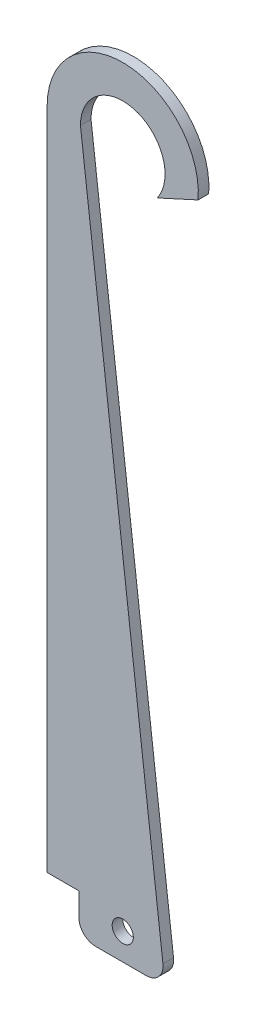
ISO-10303-21;
HEADER;
FILE_DESCRIPTION(('STEP AP214'),'2;1');
FILE_NAME('part.step','',(''),(''),'','','');
FILE_SCHEMA(('AUTOMOTIVE_DESIGN { 1 0 10303 214 1 1 1 1 }'));
ENDSEC;
DATA;
#1=APPLICATION_CONTEXT('core data for automotive mechanical design processes');
#2=APPLICATION_PROTOCOL_DEFINITION('international standard','automotive_design',2000,#1);
#3=PRODUCT_CONTEXT('',#1,'mechanical');
#4=PRODUCT('Part','Part','',(#3));
#5=PRODUCT_RELATED_PRODUCT_CATEGORY('part','',(#4));
#6=PRODUCT_DEFINITION_FORMATION('','',#4);
#7=PRODUCT_DEFINITION_CONTEXT('part definition',#1,'design');
#8=PRODUCT_DEFINITION('design','',#6,#7);
#9=PRODUCT_DEFINITION_SHAPE('','',#8);
#10=(LENGTH_UNIT() NAMED_UNIT(*) SI_UNIT(.MILLI.,.METRE.));
#11=(NAMED_UNIT(*) PLANE_ANGLE_UNIT() SI_UNIT($,.RADIAN.));
#12=(NAMED_UNIT(*) SI_UNIT($,.STERADIAN.) SOLID_ANGLE_UNIT());
#13=UNCERTAINTY_MEASURE_WITH_UNIT(LENGTH_MEASURE(1.E-05),#10,'distance_accuracy_value','');
#14=(GEOMETRIC_REPRESENTATION_CONTEXT(3) GLOBAL_UNCERTAINTY_ASSIGNED_CONTEXT((#13)) GLOBAL_UNIT_ASSIGNED_CONTEXT((#10,
#11,#12)) REPRESENTATION_CONTEXT('',''));
#15=CARTESIAN_POINT('',(0.,0.,0.));
#16=DIRECTION('',(0.,0.,1.));
#17=DIRECTION('',(1.,0.,0.));
#18=AXIS2_PLACEMENT_3D('',#15,#16,#17);
#19=CARTESIAN_POINT('',(-17.3573585994632,404.66044711258,6.35));
#20=DIRECTION('',(0.,0.,-1.));
#21=DIRECTION('',(-1.,0.,0.));
#22=AXIS2_PLACEMENT_3D('',#19,#20,#21);
#23=PLANE('',#22);
#24=DIRECTION('',(1.,0.,0.));
#25=VECTOR('',#24,1.);
#26=CARTESIAN_POINT('',(8.12565323571671,-17.7858203570019,6.35));
#27=LINE('',#26,#25);
#28=CARTESIAN_POINT('',(-33.7152583539214,-17.7858203570019,6.35));
#29=VERTEX_POINT('',#28);
#30=CARTESIAN_POINT('',(-3.15110956813895,-17.7858203570019,6.35));
#31=VERTEX_POINT('',#30);
#32=EDGE_CURVE('E171',#29,#31,#27,.T.);
#33=ORIENTED_EDGE('',*,*,#32,.T.);
#34=CARTESIAN_POINT('',(-3.15110956813895,-7.78582035700187,6.35));
#35=DIRECTION('',(0.,0.,-1.));
#36=DIRECTION('',(-1.,0.,0.));
#37=AXIS2_PLACEMENT_3D('',#34,#35,#36);
#38=CIRCLE('',#37,10.);
#39=CARTESIAN_POINT('',(6.77713111439441,-6.58997883335016,6.35));
#40=VERTEX_POINT('',#39);
#41=EDGE_CURVE('E47',#31,#40,#38,.F.);
#42=ORIENTED_EDGE('',*,*,#41,.T.);
#43=DIRECTION('',(-0.119584152365184,0.992824068253334,0.));
#44=VECTOR('',#43,1.);
#45=CARTESIAN_POINT('',(-42.7573585994632,404.66044711258,6.35));
#46=LINE('',#45,#44);
#47=CARTESIAN_POINT('',(-42.7573585994632,404.66044711258,6.35));
#48=VERTEX_POINT('',#47);
#49=EDGE_CURVE('E134',#40,#48,#46,.T.);
#50=ORIENTED_EDGE('',*,*,#49,.T.);
#51=CARTESIAN_POINT('',(-17.3573585994632,404.66044711258,6.35));
#52=DIRECTION('',(0.,0.,-1.));
#53=DIRECTION('',(-1.,0.,0.));
#54=AXIS2_PLACEMENT_3D('',#51,#52,#53);
#55=CIRCLE('',#54,25.4);
#56=CARTESIAN_POINT('',(3.33112710900608,389.924553549906,6.35));
#57=VERTEX_POINT('',#56);
#58=EDGE_CURVE('E129',#48,#57,#55,.T.);
#59=ORIENTED_EDGE('',*,*,#58,.T.);
#60=DIRECTION('',(0.909444361263456,0.415825629039511,0.));
#61=VECTOR('',#60,1.);
#62=CARTESIAN_POINT('',(3.33112710900608,389.924553549906,6.35));
#63=LINE('',#62,#61);
#64=CARTESIAN_POINT('',(27.9099257899886,401.162728041808,6.35));
#65=VERTEX_POINT('',#64);
#66=EDGE_CURVE('E118',#57,#65,#63,.T.);
#67=ORIENTED_EDGE('',*,*,#66,.T.);
#68=CARTESIAN_POINT('',(-17.3573585994632,404.66044711258,6.35));
#69=DIRECTION('',(0.,0.,1.));
#70=DIRECTION('',(1.,0.,0.));
#71=AXIS2_PLACEMENT_3D('',#68,#69,#70);
#72=CIRCLE('',#71,45.4022144249986);
#73=CARTESIAN_POINT('',(-62.7595730244618,404.66044711258,6.35));
#74=VERTEX_POINT('',#73);
#75=EDGE_CURVE('E128',#65,#74,#72,.T.);
#76=ORIENTED_EDGE('',*,*,#75,.T.);
#77=DIRECTION('',(0.,-1.,0.));
#78=VECTOR('',#77,1.);
#79=CARTESIAN_POINT('',(-62.7595730244618,404.66044711258,6.35));
#80=LINE('',#79,#78);
#81=CARTESIAN_POINT('',(-62.7595730244618,6.09017964299815,6.35));
#82=VERTEX_POINT('',#81);
#83=EDGE_CURVE('E219',#74,#82,#80,.T.);
#84=ORIENTED_EDGE('',*,*,#83,.T.);
#85=DIRECTION('',(1.,0.,0.));
#86=VECTOR('',#85,1.);
#87=CARTESIAN_POINT('',(-43.7152583539215,6.09017964299815,6.35));
#88=LINE('',#87,#86);
#89=CARTESIAN_POINT('',(-43.7152583539215,6.09017964299815,6.35));
#90=VERTEX_POINT('',#89);
#91=EDGE_CURVE('E240',#82,#90,#88,.T.);
#92=ORIENTED_EDGE('',*,*,#91,.T.);
#93=DIRECTION('',(0.,-1.,0.));
#94=VECTOR('',#93,1.);
#95=CARTESIAN_POINT('',(-43.7152583539215,-17.7858203570019,6.35));
#96=LINE('',#95,#94);
#97=CARTESIAN_POINT('',(-43.7152583539215,-7.78582035700185,6.35));
#98=VERTEX_POINT('',#97);
#99=EDGE_CURVE('E237',#90,#98,#96,.T.);
#100=ORIENTED_EDGE('',*,*,#99,.T.);
#101=CARTESIAN_POINT('',(-33.7152583539215,-7.78582035700185,6.35));
#102=DIRECTION('',(0.,0.,-1.));
#103=DIRECTION('',(-1.,0.,0.));
#104=AXIS2_PLACEMENT_3D('',#101,#102,#103);
#105=CIRCLE('',#104,10.);
#106=EDGE_CURVE('E167',#98,#29,#105,.F.);
#107=ORIENTED_EDGE('',*,*,#106,.T.);
#108=EDGE_LOOP('',(#33,#42,#50,#59,#67,#76,#84,#92,#100,#107));
#109=FACE_BOUND('',#108,.T.);
#110=CARTESIAN_POINT('',(-17.3573585994632,-1.73955288741989,6.35));
#111=DIRECTION('',(0.,0.,1.));
#112=DIRECTION('',(1.,0.,0.));
#113=AXIS2_PLACEMENT_3D('',#110,#111,#112);
#114=CIRCLE('',#113,6.35);
#115=CARTESIAN_POINT('',(-11.0073585994632,-1.73955288741989,6.35));
#116=VERTEX_POINT('',#115);
#117=EDGE_CURVE('E233',#116,#116,#114,.T.);
#118=ORIENTED_EDGE('',*,*,#117,.F.);
#119=EDGE_LOOP('',(#118));
#120=FACE_BOUND('',#119,.T.);
#121=ADVANCED_FACE('F38',(#109,#120),#23,.F.);
#122=CARTESIAN_POINT('',(-17.3573585994632,404.66044711258,0.));
#123=DIRECTION('',(0.,0.,-1.));
#124=DIRECTION('',(-1.,0.,0.));
#125=AXIS2_PLACEMENT_3D('',#122,#123,#124);
#126=PLANE('',#125);
#127=DIRECTION('',(-0.119584152365184,0.992824068253334,0.));
#128=VECTOR('',#127,1.);
#129=CARTESIAN_POINT('',(-42.7573585994632,404.66044711258,0.));
#130=LINE('',#129,#128);
#131=CARTESIAN_POINT('',(6.77713111439441,-6.58997883335016,0.));
#132=VERTEX_POINT('',#131);
#133=CARTESIAN_POINT('',(-42.7573585994632,404.66044711258,0.));
#134=VERTEX_POINT('',#133);
#135=EDGE_CURVE('E186',#132,#134,#130,.T.);
#136=ORIENTED_EDGE('',*,*,#135,.F.);
#137=CARTESIAN_POINT('',(-3.15110956813895,-7.78582035700187,0.));
#138=DIRECTION('',(0.,0.,-1.));
#139=DIRECTION('',(-1.,0.,0.));
#140=AXIS2_PLACEMENT_3D('',#137,#138,#139);
#141=CIRCLE('',#140,10.);
#142=CARTESIAN_POINT('',(-3.15110956813895,-17.7858203570019,0.));
#143=VERTEX_POINT('',#142);
#144=EDGE_CURVE('E158',#132,#143,#141,.T.);
#145=ORIENTED_EDGE('',*,*,#144,.T.);
#146=DIRECTION('',(1.,0.,0.));
#147=VECTOR('',#146,1.);
#148=CARTESIAN_POINT('',(8.12565323571671,-17.7858203570019,0.));
#149=LINE('',#148,#147);
#150=CARTESIAN_POINT('',(-33.7152583539214,-17.7858203570019,0.));
#151=VERTEX_POINT('',#150);
#152=EDGE_CURVE('E185',#151,#143,#149,.T.);
#153=ORIENTED_EDGE('',*,*,#152,.F.);
#154=CARTESIAN_POINT('',(-33.7152583539215,-7.78582035700185,0.));
#155=DIRECTION('',(0.,0.,-1.));
#156=DIRECTION('',(-1.,0.,0.));
#157=AXIS2_PLACEMENT_3D('',#154,#155,#156);
#158=CIRCLE('',#157,10.);
#159=CARTESIAN_POINT('',(-43.7152583539215,-7.78582035700185,0.));
#160=VERTEX_POINT('',#159);
#161=EDGE_CURVE('E150',#151,#160,#158,.T.);
#162=ORIENTED_EDGE('',*,*,#161,.T.);
#163=DIRECTION('',(0.,-1.,0.));
#164=VECTOR('',#163,1.);
#165=CARTESIAN_POINT('',(-43.7152583539215,-17.7858203570019,0.));
#166=LINE('',#165,#164);
#167=CARTESIAN_POINT('',(-43.7152583539215,6.09017964299815,0.));
#168=VERTEX_POINT('',#167);
#169=EDGE_CURVE('E190',#168,#160,#166,.T.);
#170=ORIENTED_EDGE('',*,*,#169,.F.);
#171=DIRECTION('',(1.,0.,0.));
#172=VECTOR('',#171,1.);
#173=CARTESIAN_POINT('',(-43.7152583539215,6.09017964299815,0.));
#174=LINE('',#173,#172);
#175=CARTESIAN_POINT('',(-62.7595730244618,6.09017964299815,0.));
#176=VERTEX_POINT('',#175);
#177=EDGE_CURVE('E195',#176,#168,#174,.T.);
#178=ORIENTED_EDGE('',*,*,#177,.F.);
#179=DIRECTION('',(0.,-1.,0.));
#180=VECTOR('',#179,1.);
#181=CARTESIAN_POINT('',(-62.7595730244618,404.66044711258,0.));
#182=LINE('',#181,#180);
#183=CARTESIAN_POINT('',(-62.7595730244618,404.66044711258,0.));
#184=VERTEX_POINT('',#183);
#185=EDGE_CURVE('E218',#184,#176,#182,.T.);
#186=ORIENTED_EDGE('',*,*,#185,.F.);
#187=CARTESIAN_POINT('',(-17.3573585994632,404.66044711258,0.));
#188=DIRECTION('',(0.,0.,1.));
#189=DIRECTION('',(1.,0.,0.));
#190=AXIS2_PLACEMENT_3D('',#187,#188,#189);
#191=CIRCLE('',#190,45.4022144249986);
#192=CARTESIAN_POINT('',(27.9099257899886,401.162728041808,0.));
#193=VERTEX_POINT('',#192);
#194=EDGE_CURVE('E223',#193,#184,#191,.T.);
#195=ORIENTED_EDGE('',*,*,#194,.F.);
#196=DIRECTION('',(0.909444361263456,0.415825629039511,0.));
#197=VECTOR('',#196,1.);
#198=CARTESIAN_POINT('',(3.33112710900608,389.924553549906,0.));
#199=LINE('',#198,#197);
#200=CARTESIAN_POINT('',(3.33112710900608,389.924553549906,0.));
#201=VERTEX_POINT('',#200);
#202=EDGE_CURVE('E229',#201,#193,#199,.T.);
#203=ORIENTED_EDGE('',*,*,#202,.F.);
#204=CARTESIAN_POINT('',(-17.3573585994632,404.66044711258,0.));
#205=DIRECTION('',(0.,0.,-1.));
#206=DIRECTION('',(1.,0.,0.));
#207=AXIS2_PLACEMENT_3D('',#204,#205,#206);
#208=CIRCLE('',#207,25.4);
#209=EDGE_CURVE('E139',#134,#201,#208,.T.);
#210=ORIENTED_EDGE('',*,*,#209,.F.);
#211=EDGE_LOOP('',(#136,#145,#153,#162,#170,#178,#186,#195,#203,#210));
#212=FACE_BOUND('',#211,.T.);
#213=CARTESIAN_POINT('',(-17.3573585994632,-1.73955288741989,0.));
#214=DIRECTION('',(0.,0.,1.));
#215=DIRECTION('',(1.,0.,0.));
#216=AXIS2_PLACEMENT_3D('',#213,#214,#215);
#217=CIRCLE('',#216,6.35);
#218=CARTESIAN_POINT('',(-11.0073585994632,-1.73955288741989,0.));
#219=VERTEX_POINT('',#218);
#220=EDGE_CURVE('E247',#219,#219,#217,.T.);
#221=ORIENTED_EDGE('',*,*,#220,.T.);
#222=EDGE_LOOP('',(#221));
#223=FACE_BOUND('',#222,.T.);
#224=ADVANCED_FACE('F183',(#212,#223),#126,.T.);
#225=CARTESIAN_POINT('',(3.33112710900608,389.924553549906,6.35));
#226=DIRECTION('',(-0.415825629039511,0.909444361263456,0.));
#227=DIRECTION('',(-0.909444361263456,-0.415825629039511,0.));
#228=AXIS2_PLACEMENT_3D('',#225,#226,#227);
#229=PLANE('',#228);
#230=ORIENTED_EDGE('',*,*,#202,.T.);
#231=DIRECTION('',(0.,0.,-1.));
#232=VECTOR('',#231,1.);
#233=CARTESIAN_POINT('',(27.9099257899886,401.162728041808,6.35));
#234=LINE('',#233,#232);
#235=EDGE_CURVE('E124',#65,#193,#234,.T.);
#236=ORIENTED_EDGE('',*,*,#235,.F.);
#237=ORIENTED_EDGE('',*,*,#66,.F.);
#238=DIRECTION('',(0.,0.,-1.));
#239=VECTOR('',#238,1.);
#240=CARTESIAN_POINT('',(3.33112710900608,389.924553549906,6.35));
#241=LINE('',#240,#239);
#242=EDGE_CURVE('E122',#57,#201,#241,.T.);
#243=ORIENTED_EDGE('',*,*,#242,.T.);
#244=EDGE_LOOP('',(#230,#236,#237,#243));
#245=FACE_BOUND('',#244,.T.);
#246=ADVANCED_FACE('F120',(#245),#229,.F.);
#247=CARTESIAN_POINT('',(-17.3573585994632,404.66044711258,6.35));
#248=DIRECTION('',(0.,0.,-1.));
#249=DIRECTION('',(-1.,0.,0.));
#250=AXIS2_PLACEMENT_3D('',#247,#248,#249);
#251=CYLINDRICAL_SURFACE('',#250,45.4022144249986);
#252=ORIENTED_EDGE('',*,*,#194,.T.);
#253=DIRECTION('',(0.,0.,-1.));
#254=VECTOR('',#253,1.);
#255=CARTESIAN_POINT('',(-62.7595730244618,404.66044711258,6.35));
#256=LINE('',#255,#254);
#257=EDGE_CURVE('E152',#74,#184,#256,.T.);
#258=ORIENTED_EDGE('',*,*,#257,.F.);
#259=ORIENTED_EDGE('',*,*,#75,.F.);
#260=ORIENTED_EDGE('',*,*,#235,.T.);
#261=EDGE_LOOP('',(#252,#258,#259,#260));
#262=FACE_BOUND('',#261,.T.);
#263=ADVANCED_FACE('F281',(#262),#251,.T.);
#264=CARTESIAN_POINT('',(-62.7595730244618,404.66044711258,6.35));
#265=DIRECTION('',(1.,0.,0.));
#266=DIRECTION('',(0.,0.,-1.));
#267=AXIS2_PLACEMENT_3D('',#264,#265,#266);
#268=PLANE('',#267);
#269=ORIENTED_EDGE('',*,*,#185,.T.);
#270=DIRECTION('',(0.,0.,-1.));
#271=VECTOR('',#270,1.);
#272=CARTESIAN_POINT('',(-62.7595730244618,6.09017964299815,6.35));
#273=LINE('',#272,#271);
#274=EDGE_CURVE('E207',#82,#176,#273,.T.);
#275=ORIENTED_EDGE('',*,*,#274,.F.);
#276=ORIENTED_EDGE('',*,*,#83,.F.);
#277=ORIENTED_EDGE('',*,*,#257,.T.);
#278=EDGE_LOOP('',(#269,#275,#276,#277));
#279=FACE_BOUND('',#278,.T.);
#280=ADVANCED_FACE('F216',(#279),#268,.F.);
#281=CARTESIAN_POINT('',(-43.7152583539215,6.09017964299815,6.35));
#282=DIRECTION('',(0.,1.,0.));
#283=DIRECTION('',(0.,0.,1.));
#284=AXIS2_PLACEMENT_3D('',#281,#282,#283);
#285=PLANE('',#284);
#286=ORIENTED_EDGE('',*,*,#177,.T.);
#287=DIRECTION('',(0.,0.,-1.));
#288=VECTOR('',#287,1.);
#289=CARTESIAN_POINT('',(-43.7152583539215,6.09017964299815,6.35));
#290=LINE('',#289,#288);
#291=EDGE_CURVE('E203',#90,#168,#290,.T.);
#292=ORIENTED_EDGE('',*,*,#291,.F.);
#293=ORIENTED_EDGE('',*,*,#91,.F.);
#294=ORIENTED_EDGE('',*,*,#274,.T.);
#295=EDGE_LOOP('',(#286,#292,#293,#294));
#296=FACE_BOUND('',#295,.T.);
#297=ADVANCED_FACE('F275',(#296),#285,.F.);
#298=CARTESIAN_POINT('',(-43.7152583539215,-17.7858203570019,6.35));
#299=DIRECTION('',(1.,0.,0.));
#300=DIRECTION('',(0.,0.,-1.));
#301=AXIS2_PLACEMENT_3D('',#298,#299,#300);
#302=PLANE('',#301);
#303=ORIENTED_EDGE('',*,*,#169,.T.);
#304=DIRECTION('',(0.,0.,-1.));
#305=VECTOR('',#304,1.);
#306=CARTESIAN_POINT('',(-43.7152583539215,-7.78582035700185,6.35));
#307=LINE('',#306,#305);
#308=EDGE_CURVE('E11',#160,#98,#307,.F.);
#309=ORIENTED_EDGE('',*,*,#308,.T.);
#310=ORIENTED_EDGE('',*,*,#99,.F.);
#311=ORIENTED_EDGE('',*,*,#291,.T.);
#312=EDGE_LOOP('',(#303,#309,#310,#311));
#313=FACE_BOUND('',#312,.T.);
#314=ADVANCED_FACE('F272',(#313),#302,.F.);
#315=CARTESIAN_POINT('',(8.12565323571671,-17.7858203570019,6.35));
#316=DIRECTION('',(0.,1.,0.));
#317=DIRECTION('',(-1.,0.,0.));
#318=AXIS2_PLACEMENT_3D('',#315,#316,#317);
#319=PLANE('',#318);
#320=ORIENTED_EDGE('',*,*,#152,.T.);
#321=DIRECTION('',(0.,0.,-1.));
#322=VECTOR('',#321,1.);
#323=CARTESIAN_POINT('',(-3.15110956813895,-17.7858203570019,6.35));
#324=LINE('',#323,#322);
#325=EDGE_CURVE('E60',#143,#31,#324,.F.);
#326=ORIENTED_EDGE('',*,*,#325,.T.);
#327=ORIENTED_EDGE('',*,*,#32,.F.);
#328=DIRECTION('',(0.,0.,-1.));
#329=VECTOR('',#328,1.);
#330=CARTESIAN_POINT('',(-33.7152583539215,-17.7858203570019,6.35));
#331=LINE('',#330,#329);
#332=EDGE_CURVE('E161',#29,#151,#331,.T.);
#333=ORIENTED_EDGE('',*,*,#332,.T.);
#334=EDGE_LOOP('',(#320,#326,#327,#333));
#335=FACE_BOUND('',#334,.T.);
#336=ADVANCED_FACE('F187',(#335),#319,.F.);
#337=CARTESIAN_POINT('',(-42.7573585994632,404.66044711258,6.35));
#338=DIRECTION('',(-0.992824068253334,-0.119584152365184,0.));
#339=DIRECTION('',(0.119584152365184,-0.992824068253334,0.));
#340=AXIS2_PLACEMENT_3D('',#337,#338,#339);
#341=PLANE('',#340);
#342=ORIENTED_EDGE('',*,*,#49,.F.);
#343=DIRECTION('',(0.,0.,-1.));
#344=VECTOR('',#343,1.);
#345=CARTESIAN_POINT('',(6.7771311143944,-6.58997883335016,6.35));
#346=LINE('',#345,#344);
#347=EDGE_CURVE('E145',#40,#132,#346,.T.);
#348=ORIENTED_EDGE('',*,*,#347,.T.);
#349=ORIENTED_EDGE('',*,*,#135,.T.);
#350=DIRECTION('',(0.,0.,-1.));
#351=VECTOR('',#350,1.);
#352=CARTESIAN_POINT('',(-42.7573585994632,404.66044711258,6.35));
#353=LINE('',#352,#351);
#354=EDGE_CURVE('E177',#48,#134,#353,.T.);
#355=ORIENTED_EDGE('',*,*,#354,.F.);
#356=EDGE_LOOP('',(#342,#348,#349,#355));
#357=FACE_BOUND('',#356,.T.);
#358=ADVANCED_FACE('F175',(#357),#341,.F.);
#359=CARTESIAN_POINT('',(-17.3573585994632,404.66044711258,6.35));
#360=DIRECTION('',(0.,0.,-1.));
#361=DIRECTION('',(-1.,0.,0.));
#362=AXIS2_PLACEMENT_3D('',#359,#360,#361);
#363=CYLINDRICAL_SURFACE('',#362,25.4);
#364=ORIENTED_EDGE('',*,*,#209,.T.);
#365=ORIENTED_EDGE('',*,*,#242,.F.);
#366=ORIENTED_EDGE('',*,*,#58,.F.);
#367=ORIENTED_EDGE('',*,*,#354,.T.);
#368=EDGE_LOOP('',(#364,#365,#366,#367));
#369=FACE_BOUND('',#368,.T.);
#370=ADVANCED_FACE('F141',(#369),#363,.F.);
#371=CARTESIAN_POINT('',(-17.3573585994632,-1.73955288741989,6.35));
#372=DIRECTION('',(0.,0.,-1.));
#373=DIRECTION('',(-1.,0.,0.));
#374=AXIS2_PLACEMENT_3D('',#371,#372,#373);
#375=CYLINDRICAL_SURFACE('',#374,6.35);
#376=ORIENTED_EDGE('',*,*,#117,.T.);
#377=EDGE_LOOP('',(#376));
#378=FACE_BOUND('',#377,.T.);
#379=ORIENTED_EDGE('',*,*,#220,.F.);
#380=EDGE_LOOP('',(#379));
#381=FACE_BOUND('',#380,.T.);
#382=ADVANCED_FACE('F255',(#378,#381),#375,.F.);
#383=CARTESIAN_POINT('',(-3.15110956813895,-7.78582035700187,6.35));
#384=DIRECTION('',(0.,0.,-1.));
#385=DIRECTION('',(-1.,0.,0.));
#386=AXIS2_PLACEMENT_3D('',#383,#384,#385);
#387=CYLINDRICAL_SURFACE('',#386,10.);
#388=ORIENTED_EDGE('',*,*,#41,.F.);
#389=ORIENTED_EDGE('',*,*,#325,.F.);
#390=ORIENTED_EDGE('',*,*,#144,.F.);
#391=ORIENTED_EDGE('',*,*,#347,.F.);
#392=EDGE_LOOP('',(#388,#389,#390,#391));
#393=FACE_BOUND('',#392,.T.);
#394=ADVANCED_FACE('F180',(#393),#387,.T.);
#395=CARTESIAN_POINT('',(-33.7152583539215,-7.78582035700185,6.35));
#396=DIRECTION('',(0.,0.,-1.));
#397=DIRECTION('',(-1.,0.,0.));
#398=AXIS2_PLACEMENT_3D('',#395,#396,#397);
#399=CYLINDRICAL_SURFACE('',#398,10.);
#400=ORIENTED_EDGE('',*,*,#106,.F.);
#401=ORIENTED_EDGE('',*,*,#308,.F.);
#402=ORIENTED_EDGE('',*,*,#161,.F.);
#403=ORIENTED_EDGE('',*,*,#332,.F.);
#404=EDGE_LOOP('',(#400,#401,#402,#403));
#405=FACE_BOUND('',#404,.T.);
#406=ADVANCED_FACE('F40',(#405),#399,.T.);
#407=CLOSED_SHELL('',(#121,#224,#246,#263,#280,#297,#314,#336,#358,#370,#382,#394,#406));
#408=MANIFOLD_SOLID_BREP('B2',#407);
#409=ADVANCED_BREP_SHAPE_REPRESENTATION('',(#18,#408),#14);
#410=SHAPE_DEFINITION_REPRESENTATION(#9,#409);
ENDSEC;
END-ISO-10303-21;
